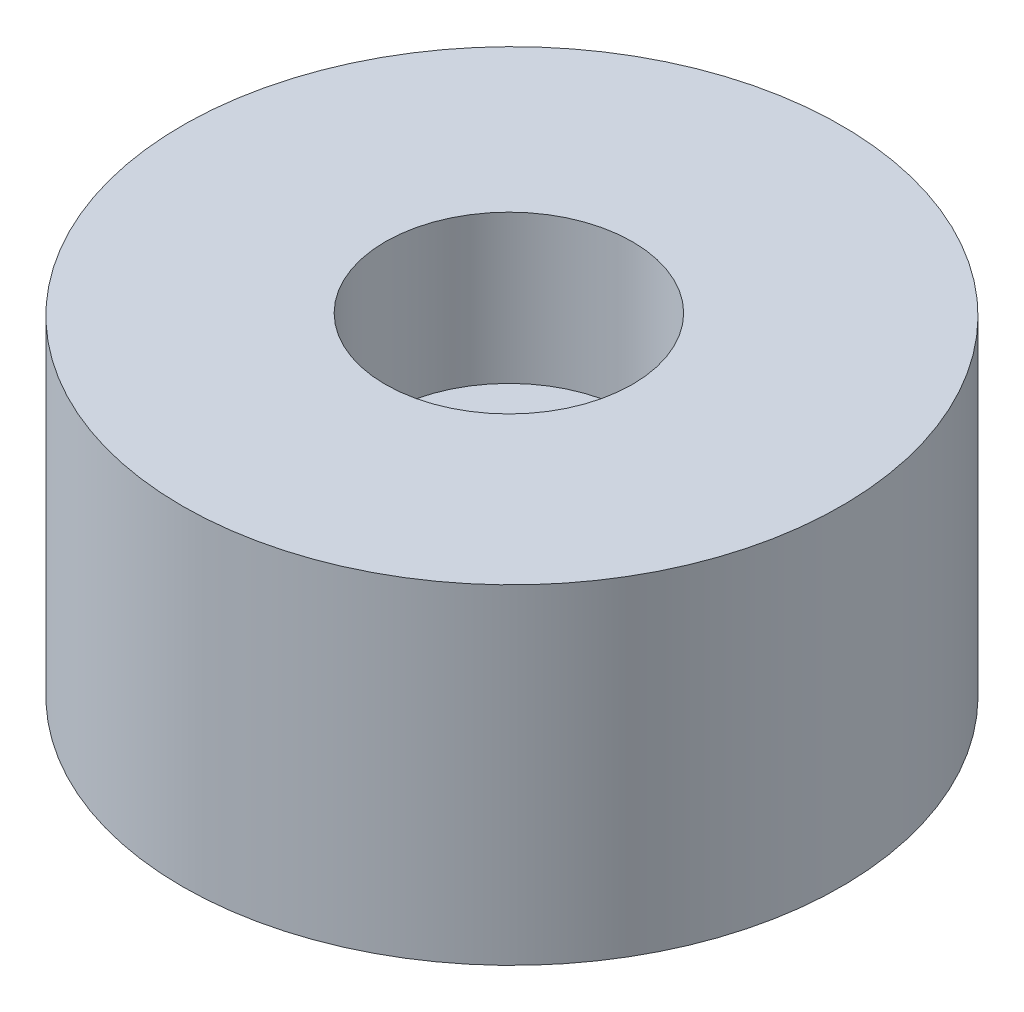
ISO-10303-21;
HEADER;
FILE_DESCRIPTION(('STEP AP214'),'2;1');
FILE_NAME('part.step','',(''),(''),'','','');
FILE_SCHEMA(('AUTOMOTIVE_DESIGN { 1 0 10303 214 1 1 1 1 }'));
ENDSEC;
DATA;
#1=APPLICATION_CONTEXT('core data for automotive mechanical design processes');
#2=APPLICATION_PROTOCOL_DEFINITION('international standard','automotive_design',2000,#1);
#3=PRODUCT_CONTEXT('',#1,'mechanical');
#4=PRODUCT('Part','Part','',(#3));
#5=PRODUCT_RELATED_PRODUCT_CATEGORY('part','',(#4));
#6=PRODUCT_DEFINITION_FORMATION('','',#4);
#7=PRODUCT_DEFINITION_CONTEXT('part definition',#1,'design');
#8=PRODUCT_DEFINITION('design','',#6,#7);
#9=PRODUCT_DEFINITION_SHAPE('','',#8);
#10=(LENGTH_UNIT() NAMED_UNIT(*) SI_UNIT(.MILLI.,.METRE.));
#11=(NAMED_UNIT(*) PLANE_ANGLE_UNIT() SI_UNIT($,.RADIAN.));
#12=(NAMED_UNIT(*) SI_UNIT($,.STERADIAN.) SOLID_ANGLE_UNIT());
#13=UNCERTAINTY_MEASURE_WITH_UNIT(LENGTH_MEASURE(1.E-05),#10,'distance_accuracy_value','');
#14=(GEOMETRIC_REPRESENTATION_CONTEXT(3) GLOBAL_UNCERTAINTY_ASSIGNED_CONTEXT((#13)) GLOBAL_UNIT_ASSIGNED_CONTEXT((#10,
#11,#12)) REPRESENTATION_CONTEXT('',''));
#15=CARTESIAN_POINT('',(0.,0.,0.));
#16=DIRECTION('',(0.,0.,1.));
#17=DIRECTION('',(1.,0.,0.));
#18=AXIS2_PLACEMENT_3D('',#15,#16,#17);
#19=CARTESIAN_POINT('',(-17.2786675708494,20.,-9.16467368944041));
#20=DIRECTION('',(0.,-1.,0.));
#21=DIRECTION('',(0.,0.,-1.));
#22=AXIS2_PLACEMENT_3D('',#19,#20,#21);
#23=CYLINDRICAL_SURFACE('',#22,20.);
#24=CARTESIAN_POINT('',(-17.2786675708494,20.,-9.16467368944041));
#25=DIRECTION('',(0.,1.,0.));
#26=DIRECTION('',(0.,0.,1.));
#27=AXIS2_PLACEMENT_3D('',#24,#25,#26);
#28=CIRCLE('',#27,20.);
#29=CARTESIAN_POINT('',(-17.2786675708494,20.,10.8353263105596));
#30=VERTEX_POINT('',#29);
#31=EDGE_CURVE('E10',#30,#30,#28,.T.);
#32=ORIENTED_EDGE('',*,*,#31,.F.);
#33=EDGE_LOOP('',(#32));
#34=FACE_BOUND('',#33,.T.);
#35=CARTESIAN_POINT('',(-17.2786675708494,0.,-9.16467368944041));
#36=DIRECTION('',(0.,1.,0.));
#37=DIRECTION('',(0.,0.,1.));
#38=AXIS2_PLACEMENT_3D('',#35,#36,#37);
#39=CIRCLE('',#38,20.);
#40=CARTESIAN_POINT('',(-17.2786675708494,0.,10.8353263105596));
#41=VERTEX_POINT('',#40);
#42=EDGE_CURVE('E34',#41,#41,#39,.T.);
#43=ORIENTED_EDGE('',*,*,#42,.T.);
#44=EDGE_LOOP('',(#43));
#45=FACE_BOUND('',#44,.T.);
#46=ADVANCED_FACE('F31',(#34,#45),#23,.T.);
#47=CARTESIAN_POINT('',(-17.2786675708494,20.,-9.16467368944041));
#48=DIRECTION('',(0.,1.,0.));
#49=DIRECTION('',(0.,0.,1.));
#50=AXIS2_PLACEMENT_3D('',#47,#48,#49);
#51=PLANE('',#50);
#52=CARTESIAN_POINT('',(-17.5134267452071,20.,-9.21497922680285));
#53=DIRECTION('',(0.,1.,0.));
#54=DIRECTION('',(0.,0.,1.));
#55=AXIS2_PLACEMENT_3D('',#52,#53,#54);
#56=CIRCLE('',#55,7.5);
#57=CARTESIAN_POINT('',(-17.5134267452071,20.,-1.71497922680285));
#58=VERTEX_POINT('',#57);
#59=EDGE_CURVE('E43',#58,#58,#56,.T.);
#60=ORIENTED_EDGE('',*,*,#59,.F.);
#61=EDGE_LOOP('',(#60));
#62=FACE_BOUND('',#61,.T.);
#63=ORIENTED_EDGE('',*,*,#31,.T.);
#64=EDGE_LOOP('',(#63));
#65=FACE_BOUND('',#64,.T.);
#66=ADVANCED_FACE('F58',(#62,#65),#51,.T.);
#67=CARTESIAN_POINT('',(-17.2786675708494,0.,-9.16467368944041));
#68=DIRECTION('',(0.,1.,0.));
#69=DIRECTION('',(0.,0.,1.));
#70=AXIS2_PLACEMENT_3D('',#67,#68,#69);
#71=PLANE('',#70);
#72=ORIENTED_EDGE('',*,*,#42,.F.);
#73=EDGE_LOOP('',(#72));
#74=FACE_BOUND('',#73,.T.);
#75=ADVANCED_FACE('F54',(#74),#71,.F.);
#76=CARTESIAN_POINT('',(-17.5134267452071,11.,-9.21497922680285));
#77=DIRECTION('',(0.,1.,0.));
#78=DIRECTION('',(0.,0.,1.));
#79=AXIS2_PLACEMENT_3D('',#76,#77,#78);
#80=CYLINDRICAL_SURFACE('',#79,7.5);
#81=CARTESIAN_POINT('',(-17.5134267452071,11.,-9.21497922680285));
#82=DIRECTION('',(0.,1.,0.));
#83=DIRECTION('',(0.,0.,1.));
#84=AXIS2_PLACEMENT_3D('',#81,#82,#83);
#85=CIRCLE('',#84,7.5);
#86=CARTESIAN_POINT('',(-17.5134267452071,11.,-1.71497922680285));
#87=VERTEX_POINT('',#86);
#88=EDGE_CURVE('E41',#87,#87,#85,.T.);
#89=ORIENTED_EDGE('',*,*,#88,.F.);
#90=EDGE_LOOP('',(#89));
#91=FACE_BOUND('',#90,.T.);
#92=ORIENTED_EDGE('',*,*,#59,.T.);
#93=EDGE_LOOP('',(#92));
#94=FACE_BOUND('',#93,.T.);
#95=ADVANCED_FACE('F51',(#91,#94),#80,.F.);
#96=CARTESIAN_POINT('',(-17.5134267452071,11.,-9.21497922680285));
#97=DIRECTION('',(0.,1.,0.));
#98=DIRECTION('',(0.,0.,1.));
#99=AXIS2_PLACEMENT_3D('',#96,#97,#98);
#100=PLANE('',#99);
#101=ORIENTED_EDGE('',*,*,#88,.T.);
#102=EDGE_LOOP('',(#101));
#103=FACE_BOUND('',#102,.T.);
#104=ADVANCED_FACE('F49',(#103),#100,.T.);
#105=CLOSED_SHELL('',(#46,#66,#75,#95,#104));
#106=MANIFOLD_SOLID_BREP('B2',#105);
#107=ADVANCED_BREP_SHAPE_REPRESENTATION('',(#18,#106),#14);
#108=SHAPE_DEFINITION_REPRESENTATION(#9,#107);
ENDSEC;
END-ISO-10303-21;
